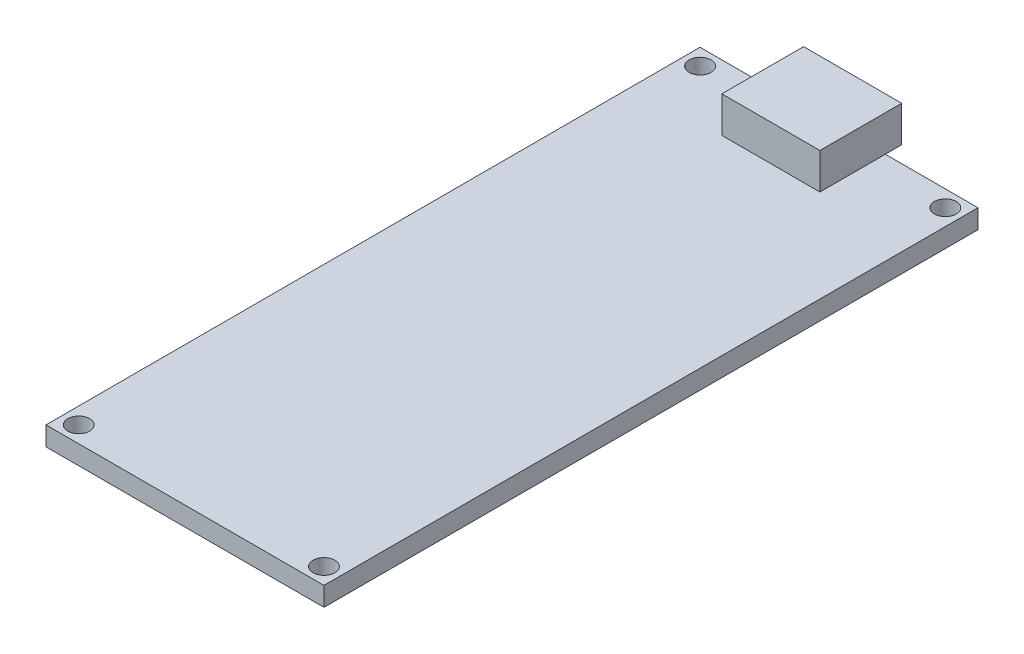
ISO-10303-21;
HEADER;
FILE_DESCRIPTION(('STEP AP214'),'2;1');
FILE_NAME('part.step','',(''),(''),'','','');
FILE_SCHEMA(('AUTOMOTIVE_DESIGN { 1 0 10303 214 1 1 1 1 }'));
ENDSEC;
DATA;
#1=APPLICATION_CONTEXT('core data for automotive mechanical design processes');
#2=APPLICATION_PROTOCOL_DEFINITION('international standard','automotive_design',2000,#1);
#3=PRODUCT_CONTEXT('',#1,'mechanical');
#4=PRODUCT('Part','Part','',(#3));
#5=PRODUCT_RELATED_PRODUCT_CATEGORY('part','',(#4));
#6=PRODUCT_DEFINITION_FORMATION('','',#4);
#7=PRODUCT_DEFINITION_CONTEXT('part definition',#1,'design');
#8=PRODUCT_DEFINITION('design','',#6,#7);
#9=PRODUCT_DEFINITION_SHAPE('','',#8);
#10=(LENGTH_UNIT() NAMED_UNIT(*) SI_UNIT(.MILLI.,.METRE.));
#11=(NAMED_UNIT(*) PLANE_ANGLE_UNIT() SI_UNIT($,.RADIAN.));
#12=(NAMED_UNIT(*) SI_UNIT($,.STERADIAN.) SOLID_ANGLE_UNIT());
#13=UNCERTAINTY_MEASURE_WITH_UNIT(LENGTH_MEASURE(1.E-05),#10,'distance_accuracy_value','');
#14=(GEOMETRIC_REPRESENTATION_CONTEXT(3) GLOBAL_UNCERTAINTY_ASSIGNED_CONTEXT((#13)) GLOBAL_UNIT_ASSIGNED_CONTEXT((#10,
#11,#12)) REPRESENTATION_CONTEXT('',''));
#15=CARTESIAN_POINT('',(0.,0.,0.));
#16=DIRECTION('',(0.,0.,1.));
#17=DIRECTION('',(1.,0.,0.));
#18=AXIS2_PLACEMENT_3D('',#15,#16,#17);
#19=CARTESIAN_POINT('',(0.,1.75,0.));
#20=DIRECTION('',(0.,-1.,0.));
#21=DIRECTION('',(0.,0.,-1.));
#22=AXIS2_PLACEMENT_3D('',#19,#20,#21);
#23=PLANE('',#22);
#24=DIRECTION('',(1.,0.,0.));
#25=VECTOR('',#24,1.);
#26=CARTESIAN_POINT('',(-4.75,1.75,-24.));
#27=LINE('',#26,#25);
#28=CARTESIAN_POINT('',(-4.75,1.75,-24.));
#29=VERTEX_POINT('',#28);
#30=CARTESIAN_POINT('',(4.25,1.75,-24.));
#31=VERTEX_POINT('',#30);
#32=EDGE_CURVE('E55',#29,#31,#27,.T.);
#33=ORIENTED_EDGE('',*,*,#32,.F.);
#34=DIRECTION('',(0.,0.,-1.));
#35=VECTOR('',#34,1.);
#36=CARTESIAN_POINT('',(-4.75,1.75,-24.));
#37=LINE('',#36,#35);
#38=CARTESIAN_POINT('',(-4.75,1.75,-30.));
#39=VERTEX_POINT('',#38);
#40=EDGE_CURVE('E60',#29,#39,#37,.T.);
#41=ORIENTED_EDGE('',*,*,#40,.T.);
#42=DIRECTION('',(-1.,0.,0.));
#43=VECTOR('',#42,1.);
#44=CARTESIAN_POINT('',(-12.75,1.75,-30.));
#45=LINE('',#44,#43);
#46=CARTESIAN_POINT('',(-12.75,1.75,-30.));
#47=VERTEX_POINT('',#46);
#48=EDGE_CURVE('E201',#39,#47,#45,.T.);
#49=ORIENTED_EDGE('',*,*,#48,.T.);
#50=DIRECTION('',(0.,0.,1.));
#51=VECTOR('',#50,1.);
#52=CARTESIAN_POINT('',(-12.75,1.75,30.));
#53=LINE('',#52,#51);
#54=CARTESIAN_POINT('',(-12.75,1.75,30.));
#55=VERTEX_POINT('',#54);
#56=EDGE_CURVE('E207',#47,#55,#53,.T.);
#57=ORIENTED_EDGE('',*,*,#56,.T.);
#58=DIRECTION('',(1.,0.,0.));
#59=VECTOR('',#58,1.);
#60=CARTESIAN_POINT('',(-12.75,1.75,30.));
#61=LINE('',#60,#59);
#62=CARTESIAN_POINT('',(12.75,1.75,30.));
#63=VERTEX_POINT('',#62);
#64=EDGE_CURVE('E211',#55,#63,#61,.T.);
#65=ORIENTED_EDGE('',*,*,#64,.T.);
#66=DIRECTION('',(0.,0.,-1.));
#67=VECTOR('',#66,1.);
#68=CARTESIAN_POINT('',(12.75,1.75,30.));
#69=LINE('',#68,#67);
#70=CARTESIAN_POINT('',(12.75,1.75,-30.));
#71=VERTEX_POINT('',#70);
#72=EDGE_CURVE('E197',#63,#71,#69,.T.);
#73=ORIENTED_EDGE('',*,*,#72,.T.);
#74=CARTESIAN_POINT('',(4.25,1.75,-30.));
#75=VERTEX_POINT('',#74);
#76=EDGE_CURVE('E203',#71,#75,#45,.T.);
#77=ORIENTED_EDGE('',*,*,#76,.T.);
#78=DIRECTION('',(0.,0.,-1.));
#79=VECTOR('',#78,1.);
#80=CARTESIAN_POINT('',(4.25,1.75,-24.));
#81=LINE('',#80,#79);
#82=EDGE_CURVE('E140',#31,#75,#81,.T.);
#83=ORIENTED_EDGE('',*,*,#82,.F.);
#84=EDGE_LOOP('',(#33,#41,#49,#57,#65,#73,#77,#83));
#85=FACE_BOUND('',#84,.T.);
#86=CARTESIAN_POINT('',(11.25,1.75,-28.5));
#87=DIRECTION('',(0.,1.,0.));
#88=DIRECTION('',(0.,0.,1.));
#89=AXIS2_PLACEMENT_3D('',#86,#87,#88);
#90=CIRCLE('',#89,1.);
#91=CARTESIAN_POINT('',(11.25,1.75,-27.5));
#92=VERTEX_POINT('',#91);
#93=EDGE_CURVE('E189',#92,#92,#90,.T.);
#94=ORIENTED_EDGE('',*,*,#93,.F.);
#95=EDGE_LOOP('',(#94));
#96=FACE_BOUND('',#95,.T.);
#97=CARTESIAN_POINT('',(-11.25,1.75,-28.5));
#98=DIRECTION('',(0.,1.,0.));
#99=DIRECTION('',(0.,0.,-1.));
#100=AXIS2_PLACEMENT_3D('',#97,#98,#99);
#101=CIRCLE('',#100,1.);
#102=CARTESIAN_POINT('',(-11.25,1.75,-29.5));
#103=VERTEX_POINT('',#102);
#104=EDGE_CURVE('E181',#103,#103,#101,.T.);
#105=ORIENTED_EDGE('',*,*,#104,.F.);
#106=EDGE_LOOP('',(#105));
#107=FACE_BOUND('',#106,.T.);
#108=CARTESIAN_POINT('',(11.25,1.75,28.5));
#109=DIRECTION('',(0.,1.,0.));
#110=DIRECTION('',(0.,0.,-1.));
#111=AXIS2_PLACEMENT_3D('',#108,#109,#110);
#112=CIRCLE('',#111,1.);
#113=CARTESIAN_POINT('',(11.25,1.75,27.5));
#114=VERTEX_POINT('',#113);
#115=EDGE_CURVE('E173',#114,#114,#112,.T.);
#116=ORIENTED_EDGE('',*,*,#115,.F.);
#117=EDGE_LOOP('',(#116));
#118=FACE_BOUND('',#117,.T.);
#119=CARTESIAN_POINT('',(-11.25,1.75,28.5));
#120=DIRECTION('',(0.,1.,0.));
#121=DIRECTION('',(0.,0.,1.));
#122=AXIS2_PLACEMENT_3D('',#119,#120,#121);
#123=CIRCLE('',#122,1.);
#124=CARTESIAN_POINT('',(-11.25,1.75,29.5));
#125=VERTEX_POINT('',#124);
#126=EDGE_CURVE('E165',#125,#125,#123,.T.);
#127=ORIENTED_EDGE('',*,*,#126,.F.);
#128=EDGE_LOOP('',(#127));
#129=FACE_BOUND('',#128,.T.);
#130=ADVANCED_FACE('F39',(#85,#96,#107,#118,#129),#23,.F.);
#131=CARTESIAN_POINT('',(0.,0.,0.));
#132=DIRECTION('',(0.,-1.,0.));
#133=DIRECTION('',(0.,0.,-1.));
#134=AXIS2_PLACEMENT_3D('',#131,#132,#133);
#135=PLANE('',#134);
#136=CARTESIAN_POINT('',(11.25,0.,28.5));
#137=DIRECTION('',(0.,1.,0.));
#138=DIRECTION('',(0.,0.,-1.));
#139=AXIS2_PLACEMENT_3D('',#136,#137,#138);
#140=CIRCLE('',#139,1.);
#141=CARTESIAN_POINT('',(11.25,0.,27.5));
#142=VERTEX_POINT('',#141);
#143=EDGE_CURVE('E169',#142,#142,#140,.T.);
#144=ORIENTED_EDGE('',*,*,#143,.T.);
#145=EDGE_LOOP('',(#144));
#146=FACE_BOUND('',#145,.T.);
#147=CARTESIAN_POINT('',(11.25,0.,-28.5));
#148=DIRECTION('',(0.,1.,0.));
#149=DIRECTION('',(0.,0.,1.));
#150=AXIS2_PLACEMENT_3D('',#147,#148,#149);
#151=CIRCLE('',#150,1.);
#152=CARTESIAN_POINT('',(11.25,0.,-27.5));
#153=VERTEX_POINT('',#152);
#154=EDGE_CURVE('E185',#153,#153,#151,.T.);
#155=ORIENTED_EDGE('',*,*,#154,.T.);
#156=EDGE_LOOP('',(#155));
#157=FACE_BOUND('',#156,.T.);
#158=DIRECTION('',(0.,0.,-1.));
#159=VECTOR('',#158,1.);
#160=CARTESIAN_POINT('',(12.75,0.,30.));
#161=LINE('',#160,#159);
#162=CARTESIAN_POINT('',(12.75,0.,30.));
#163=VERTEX_POINT('',#162);
#164=CARTESIAN_POINT('',(12.75,0.,-30.));
#165=VERTEX_POINT('',#164);
#166=EDGE_CURVE('E193',#163,#165,#161,.T.);
#167=ORIENTED_EDGE('',*,*,#166,.F.);
#168=DIRECTION('',(1.,0.,0.));
#169=VECTOR('',#168,1.);
#170=CARTESIAN_POINT('',(-12.75,0.,30.));
#171=LINE('',#170,#169);
#172=CARTESIAN_POINT('',(-12.75,0.,30.));
#173=VERTEX_POINT('',#172);
#174=EDGE_CURVE('E202',#173,#163,#171,.T.);
#175=ORIENTED_EDGE('',*,*,#174,.F.);
#176=DIRECTION('',(0.,0.,1.));
#177=VECTOR('',#176,1.);
#178=CARTESIAN_POINT('',(-12.75,0.,30.));
#179=LINE('',#178,#177);
#180=CARTESIAN_POINT('',(-12.75,0.,-30.));
#181=VERTEX_POINT('',#180);
#182=EDGE_CURVE('E221',#181,#173,#179,.T.);
#183=ORIENTED_EDGE('',*,*,#182,.F.);
#184=DIRECTION('',(-1.,0.,0.));
#185=VECTOR('',#184,1.);
#186=CARTESIAN_POINT('',(-12.75,0.,-30.));
#187=LINE('',#186,#185);
#188=EDGE_CURVE('E218',#165,#181,#187,.T.);
#189=ORIENTED_EDGE('',*,*,#188,.F.);
#190=EDGE_LOOP('',(#167,#175,#183,#189));
#191=FACE_BOUND('',#190,.T.);
#192=CARTESIAN_POINT('',(-11.25,0.,-28.5));
#193=DIRECTION('',(0.,1.,0.));
#194=DIRECTION('',(0.,0.,-1.));
#195=AXIS2_PLACEMENT_3D('',#192,#193,#194);
#196=CIRCLE('',#195,1.);
#197=CARTESIAN_POINT('',(-11.25,0.,-29.5));
#198=VERTEX_POINT('',#197);
#199=EDGE_CURVE('E177',#198,#198,#196,.T.);
#200=ORIENTED_EDGE('',*,*,#199,.T.);
#201=EDGE_LOOP('',(#200));
#202=FACE_BOUND('',#201,.T.);
#203=CARTESIAN_POINT('',(-11.25,0.,28.5));
#204=DIRECTION('',(0.,1.,0.));
#205=DIRECTION('',(0.,0.,1.));
#206=AXIS2_PLACEMENT_3D('',#203,#204,#205);
#207=CIRCLE('',#206,1.);
#208=CARTESIAN_POINT('',(-11.25,0.,29.5));
#209=VERTEX_POINT('',#208);
#210=EDGE_CURVE('E158',#209,#209,#207,.T.);
#211=ORIENTED_EDGE('',*,*,#210,.T.);
#212=EDGE_LOOP('',(#211));
#213=FACE_BOUND('',#212,.T.);
#214=ADVANCED_FACE('F244',(#146,#157,#191,#202,#213),#135,.T.);
#215=CARTESIAN_POINT('',(12.75,1.75,30.));
#216=DIRECTION('',(-1.,0.,0.));
#217=DIRECTION('',(0.,0.,1.));
#218=AXIS2_PLACEMENT_3D('',#215,#216,#217);
#219=PLANE('',#218);
#220=ORIENTED_EDGE('',*,*,#166,.T.);
#221=DIRECTION('',(0.,-1.,0.));
#222=VECTOR('',#221,1.);
#223=CARTESIAN_POINT('',(12.75,1.75,-30.));
#224=LINE('',#223,#222);
#225=EDGE_CURVE('E11',#71,#165,#224,.T.);
#226=ORIENTED_EDGE('',*,*,#225,.F.);
#227=ORIENTED_EDGE('',*,*,#72,.F.);
#228=DIRECTION('',(0.,-1.,0.));
#229=VECTOR('',#228,1.);
#230=CARTESIAN_POINT('',(12.75,1.75,30.));
#231=LINE('',#230,#229);
#232=EDGE_CURVE('E214',#63,#163,#231,.T.);
#233=ORIENTED_EDGE('',*,*,#232,.T.);
#234=EDGE_LOOP('',(#220,#226,#227,#233));
#235=FACE_BOUND('',#234,.T.);
#236=ADVANCED_FACE('F41',(#235),#219,.F.);
#237=CARTESIAN_POINT('',(-12.75,1.75,-30.));
#238=DIRECTION('',(0.,0.,1.));
#239=DIRECTION('',(1.,0.,0.));
#240=AXIS2_PLACEMENT_3D('',#237,#238,#239);
#241=PLANE('',#240);
#242=ORIENTED_EDGE('',*,*,#188,.T.);
#243=DIRECTION('',(0.,-1.,0.));
#244=VECTOR('',#243,1.);
#245=CARTESIAN_POINT('',(-12.75,1.75,-30.));
#246=LINE('',#245,#244);
#247=EDGE_CURVE('E48',#47,#181,#246,.T.);
#248=ORIENTED_EDGE('',*,*,#247,.F.);
#249=ORIENTED_EDGE('',*,*,#48,.F.);
#250=EDGE_CURVE('E208',#75,#39,#45,.T.);
#251=ORIENTED_EDGE('',*,*,#250,.F.);
#252=ORIENTED_EDGE('',*,*,#76,.F.);
#253=ORIENTED_EDGE('',*,*,#225,.T.);
#254=EDGE_LOOP('',(#242,#248,#249,#251,#252,#253));
#255=FACE_BOUND('',#254,.T.);
#256=ADVANCED_FACE('F293',(#255),#241,.F.);
#257=CARTESIAN_POINT('',(-12.75,1.75,30.));
#258=DIRECTION('',(1.,0.,0.));
#259=DIRECTION('',(0.,0.,-1.));
#260=AXIS2_PLACEMENT_3D('',#257,#258,#259);
#261=PLANE('',#260);
#262=ORIENTED_EDGE('',*,*,#182,.T.);
#263=DIRECTION('',(0.,-1.,0.));
#264=VECTOR('',#263,1.);
#265=CARTESIAN_POINT('',(-12.75,1.75,30.));
#266=LINE('',#265,#264);
#267=EDGE_CURVE('E229',#55,#173,#266,.T.);
#268=ORIENTED_EDGE('',*,*,#267,.F.);
#269=ORIENTED_EDGE('',*,*,#56,.F.);
#270=ORIENTED_EDGE('',*,*,#247,.T.);
#271=EDGE_LOOP('',(#262,#268,#269,#270));
#272=FACE_BOUND('',#271,.T.);
#273=ADVANCED_FACE('F238',(#272),#261,.F.);
#274=CARTESIAN_POINT('',(-12.75,1.75,30.));
#275=DIRECTION('',(0.,0.,-1.));
#276=DIRECTION('',(-1.,0.,0.));
#277=AXIS2_PLACEMENT_3D('',#274,#275,#276);
#278=PLANE('',#277);
#279=ORIENTED_EDGE('',*,*,#174,.T.);
#280=ORIENTED_EDGE('',*,*,#232,.F.);
#281=ORIENTED_EDGE('',*,*,#64,.F.);
#282=ORIENTED_EDGE('',*,*,#267,.T.);
#283=EDGE_LOOP('',(#279,#280,#281,#282));
#284=FACE_BOUND('',#283,.T.);
#285=ADVANCED_FACE('F248',(#284),#278,.F.);
#286=CARTESIAN_POINT('',(11.25,1.75,-28.5));
#287=DIRECTION('',(0.,-1.,0.));
#288=DIRECTION('',(0.,0.,-1.));
#289=AXIS2_PLACEMENT_3D('',#286,#287,#288);
#290=CYLINDRICAL_SURFACE('',#289,1.);
#291=ORIENTED_EDGE('',*,*,#93,.T.);
#292=EDGE_LOOP('',(#291));
#293=FACE_BOUND('',#292,.T.);
#294=ORIENTED_EDGE('',*,*,#154,.F.);
#295=EDGE_LOOP('',(#294));
#296=FACE_BOUND('',#295,.T.);
#297=ADVANCED_FACE('F287',(#293,#296),#290,.F.);
#298=CARTESIAN_POINT('',(-11.25,1.75,-28.5));
#299=DIRECTION('',(0.,-1.,0.));
#300=DIRECTION('',(0.,0.,-1.));
#301=AXIS2_PLACEMENT_3D('',#298,#299,#300);
#302=CYLINDRICAL_SURFACE('',#301,1.);
#303=ORIENTED_EDGE('',*,*,#104,.T.);
#304=EDGE_LOOP('',(#303));
#305=FACE_BOUND('',#304,.T.);
#306=ORIENTED_EDGE('',*,*,#199,.F.);
#307=EDGE_LOOP('',(#306));
#308=FACE_BOUND('',#307,.T.);
#309=ADVANCED_FACE('F320',(#305,#308),#302,.F.);
#310=CARTESIAN_POINT('',(11.25,1.75,28.5));
#311=DIRECTION('',(0.,-1.,0.));
#312=DIRECTION('',(0.,0.,-1.));
#313=AXIS2_PLACEMENT_3D('',#310,#311,#312);
#314=CYLINDRICAL_SURFACE('',#313,1.);
#315=ORIENTED_EDGE('',*,*,#115,.T.);
#316=EDGE_LOOP('',(#315));
#317=FACE_BOUND('',#316,.T.);
#318=ORIENTED_EDGE('',*,*,#143,.F.);
#319=EDGE_LOOP('',(#318));
#320=FACE_BOUND('',#319,.T.);
#321=ADVANCED_FACE('F327',(#317,#320),#314,.F.);
#322=CARTESIAN_POINT('',(-11.25,1.75,28.5));
#323=DIRECTION('',(0.,-1.,0.));
#324=DIRECTION('',(0.,0.,-1.));
#325=AXIS2_PLACEMENT_3D('',#322,#323,#324);
#326=CYLINDRICAL_SURFACE('',#325,1.);
#327=ORIENTED_EDGE('',*,*,#126,.T.);
#328=EDGE_LOOP('',(#327));
#329=FACE_BOUND('',#328,.T.);
#330=ORIENTED_EDGE('',*,*,#210,.F.);
#331=EDGE_LOOP('',(#330));
#332=FACE_BOUND('',#331,.T.);
#333=ADVANCED_FACE('F274',(#329,#332),#326,.F.);
#334=CARTESIAN_POINT('',(-4.75,5.05,-24.));
#335=DIRECTION('',(-1.,0.,0.));
#336=DIRECTION('',(0.,0.,1.));
#337=AXIS2_PLACEMENT_3D('',#334,#335,#336);
#338=PLANE('',#337);
#339=ORIENTED_EDGE('',*,*,#40,.F.);
#340=DIRECTION('',(0.,-1.,0.));
#341=VECTOR('',#340,1.);
#342=CARTESIAN_POINT('',(-4.75,5.05,-24.));
#343=LINE('',#342,#341);
#344=CARTESIAN_POINT('',(-4.75,5.05,-24.));
#345=VERTEX_POINT('',#344);
#346=EDGE_CURVE('E135',#345,#29,#343,.T.);
#347=ORIENTED_EDGE('',*,*,#346,.F.);
#348=DIRECTION('',(0.,0.,-1.));
#349=VECTOR('',#348,1.);
#350=CARTESIAN_POINT('',(-4.75,5.05,-24.));
#351=LINE('',#350,#349);
#352=CARTESIAN_POINT('',(-4.75,5.05,-31.5));
#353=VERTEX_POINT('',#352);
#354=EDGE_CURVE('E128',#345,#353,#351,.T.);
#355=ORIENTED_EDGE('',*,*,#354,.T.);
#356=DIRECTION('',(0.,-1.,0.));
#357=VECTOR('',#356,1.);
#358=CARTESIAN_POINT('',(-4.75,5.05,-31.5));
#359=LINE('',#358,#357);
#360=CARTESIAN_POINT('',(-4.75,1.75,-31.5));
#361=VERTEX_POINT('',#360);
#362=EDGE_CURVE('E111',#353,#361,#359,.T.);
#363=ORIENTED_EDGE('',*,*,#362,.T.);
#364=EDGE_CURVE('E149',#39,#361,#37,.T.);
#365=ORIENTED_EDGE('',*,*,#364,.F.);
#366=EDGE_LOOP('',(#339,#347,#355,#363,#365));
#367=FACE_BOUND('',#366,.T.);
#368=ADVANCED_FACE('F134',(#367),#338,.T.);
#369=CARTESIAN_POINT('',(-4.75,5.05,-24.));
#370=DIRECTION('',(0.,0.,-1.));
#371=DIRECTION('',(-1.,0.,0.));
#372=AXIS2_PLACEMENT_3D('',#369,#370,#371);
#373=PLANE('',#372);
#374=ORIENTED_EDGE('',*,*,#32,.T.);
#375=DIRECTION('',(0.,-1.,0.));
#376=VECTOR('',#375,1.);
#377=CARTESIAN_POINT('',(4.25,5.05,-24.));
#378=LINE('',#377,#376);
#379=CARTESIAN_POINT('',(4.25,5.05,-24.));
#380=VERTEX_POINT('',#379);
#381=EDGE_CURVE('E159',#380,#31,#378,.T.);
#382=ORIENTED_EDGE('',*,*,#381,.F.);
#383=DIRECTION('',(1.,0.,0.));
#384=VECTOR('',#383,1.);
#385=CARTESIAN_POINT('',(-4.75,5.05,-24.));
#386=LINE('',#385,#384);
#387=EDGE_CURVE('E123',#345,#380,#386,.T.);
#388=ORIENTED_EDGE('',*,*,#387,.F.);
#389=ORIENTED_EDGE('',*,*,#346,.T.);
#390=EDGE_LOOP('',(#374,#382,#388,#389));
#391=FACE_BOUND('',#390,.T.);
#392=ADVANCED_FACE('F266',(#391),#373,.F.);
#393=CARTESIAN_POINT('',(4.25,5.05,-24.));
#394=DIRECTION('',(-1.,0.,0.));
#395=DIRECTION('',(0.,0.,1.));
#396=AXIS2_PLACEMENT_3D('',#393,#394,#395);
#397=PLANE('',#396);
#398=ORIENTED_EDGE('',*,*,#82,.T.);
#399=CARTESIAN_POINT('',(4.25,1.75,-31.5));
#400=VERTEX_POINT('',#399);
#401=EDGE_CURVE('E152',#75,#400,#81,.T.);
#402=ORIENTED_EDGE('',*,*,#401,.T.);
#403=DIRECTION('',(0.,-1.,0.));
#404=VECTOR('',#403,1.);
#405=CARTESIAN_POINT('',(4.25,5.05,-31.5));
#406=LINE('',#405,#404);
#407=CARTESIAN_POINT('',(4.25,5.05,-31.5));
#408=VERTEX_POINT('',#407);
#409=EDGE_CURVE('E122',#408,#400,#406,.T.);
#410=ORIENTED_EDGE('',*,*,#409,.F.);
#411=DIRECTION('',(0.,0.,-1.));
#412=VECTOR('',#411,1.);
#413=CARTESIAN_POINT('',(4.25,5.05,-24.));
#414=LINE('',#413,#412);
#415=EDGE_CURVE('E130',#380,#408,#414,.T.);
#416=ORIENTED_EDGE('',*,*,#415,.F.);
#417=ORIENTED_EDGE('',*,*,#381,.T.);
#418=EDGE_LOOP('',(#398,#402,#410,#416,#417));
#419=FACE_BOUND('',#418,.T.);
#420=ADVANCED_FACE('F263',(#419),#397,.F.);
#421=CARTESIAN_POINT('',(-4.75,5.05,-31.5));
#422=DIRECTION('',(0.,0.,-1.));
#423=DIRECTION('',(-1.,0.,0.));
#424=AXIS2_PLACEMENT_3D('',#421,#422,#423);
#425=PLANE('',#424);
#426=DIRECTION('',(1.,0.,0.));
#427=VECTOR('',#426,1.);
#428=CARTESIAN_POINT('',(-4.75,1.75,-31.5));
#429=LINE('',#428,#427);
#430=EDGE_CURVE('E117',#361,#400,#429,.T.);
#431=ORIENTED_EDGE('',*,*,#430,.F.);
#432=ORIENTED_EDGE('',*,*,#362,.F.);
#433=DIRECTION('',(1.,0.,0.));
#434=VECTOR('',#433,1.);
#435=CARTESIAN_POINT('',(-4.75,5.05,-31.5));
#436=LINE('',#435,#434);
#437=EDGE_CURVE('E115',#353,#408,#436,.T.);
#438=ORIENTED_EDGE('',*,*,#437,.T.);
#439=ORIENTED_EDGE('',*,*,#409,.T.);
#440=EDGE_LOOP('',(#431,#432,#438,#439));
#441=FACE_BOUND('',#440,.T.);
#442=ADVANCED_FACE('F113',(#441),#425,.T.);
#443=CARTESIAN_POINT('',(0.,5.05,0.));
#444=DIRECTION('',(0.,-1.,0.));
#445=DIRECTION('',(0.,0.,-1.));
#446=AXIS2_PLACEMENT_3D('',#443,#444,#445);
#447=PLANE('',#446);
#448=ORIENTED_EDGE('',*,*,#354,.F.);
#449=ORIENTED_EDGE('',*,*,#387,.T.);
#450=ORIENTED_EDGE('',*,*,#415,.T.);
#451=ORIENTED_EDGE('',*,*,#437,.F.);
#452=EDGE_LOOP('',(#448,#449,#450,#451));
#453=FACE_BOUND('',#452,.T.);
#454=ADVANCED_FACE('F127',(#453),#447,.F.);
#455=CARTESIAN_POINT('',(0.,1.75,0.));
#456=DIRECTION('',(0.,-1.,0.));
#457=DIRECTION('',(0.,0.,-1.));
#458=AXIS2_PLACEMENT_3D('',#455,#456,#457);
#459=PLANE('',#458);
#460=ORIENTED_EDGE('',*,*,#401,.F.);
#461=ORIENTED_EDGE('',*,*,#250,.T.);
#462=ORIENTED_EDGE('',*,*,#364,.T.);
#463=ORIENTED_EDGE('',*,*,#430,.T.);
#464=EDGE_LOOP('',(#460,#461,#462,#463));
#465=FACE_BOUND('',#464,.T.);
#466=ADVANCED_FACE('F259',(#465),#459,.T.);
#467=CLOSED_SHELL('',(#130,#214,#236,#256,#273,#285,#297,#309,#321,#333,#368,#392,#420,#442,
#454,#466));
#468=MANIFOLD_SOLID_BREP('B2',#467);
#469=ADVANCED_BREP_SHAPE_REPRESENTATION('',(#18,#468),#14);
#470=SHAPE_DEFINITION_REPRESENTATION(#9,#469);
ENDSEC;
END-ISO-10303-21;
